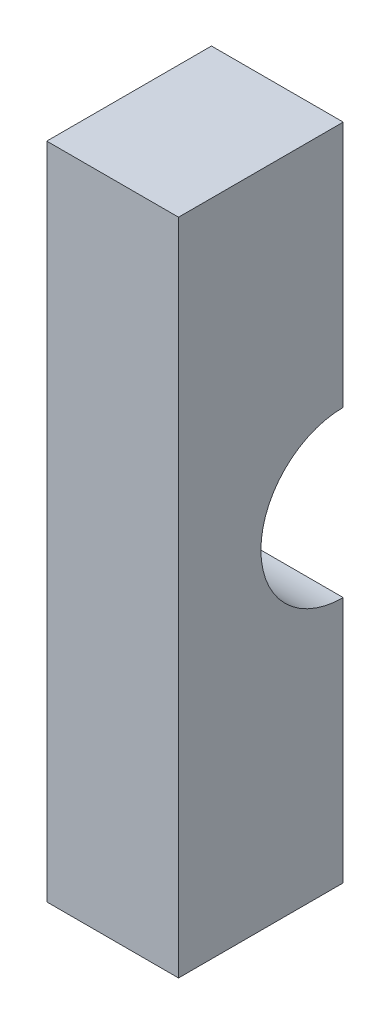
ISO-10303-21;
HEADER;
FILE_DESCRIPTION(('STEP AP214'),'2;1');
FILE_NAME('part.step','',(''),(''),'','','');
FILE_SCHEMA(('AUTOMOTIVE_DESIGN { 1 0 10303 214 1 1 1 1 }'));
ENDSEC;
DATA;
#1=APPLICATION_CONTEXT('core data for automotive mechanical design processes');
#2=APPLICATION_PROTOCOL_DEFINITION('international standard','automotive_design',2000,#1);
#3=PRODUCT_CONTEXT('',#1,'mechanical');
#4=PRODUCT('Part','Part','',(#3));
#5=PRODUCT_RELATED_PRODUCT_CATEGORY('part','',(#4));
#6=PRODUCT_DEFINITION_FORMATION('','',#4);
#7=PRODUCT_DEFINITION_CONTEXT('part definition',#1,'design');
#8=PRODUCT_DEFINITION('design','',#6,#7);
#9=PRODUCT_DEFINITION_SHAPE('','',#8);
#10=(LENGTH_UNIT() NAMED_UNIT(*) SI_UNIT(.MILLI.,.METRE.));
#11=(NAMED_UNIT(*) PLANE_ANGLE_UNIT() SI_UNIT($,.RADIAN.));
#12=(NAMED_UNIT(*) SI_UNIT($,.STERADIAN.) SOLID_ANGLE_UNIT());
#13=UNCERTAINTY_MEASURE_WITH_UNIT(LENGTH_MEASURE(1.E-05),#10,'distance_accuracy_value','');
#14=(GEOMETRIC_REPRESENTATION_CONTEXT(3) GLOBAL_UNCERTAINTY_ASSIGNED_CONTEXT((#13)) GLOBAL_UNIT_ASSIGNED_CONTEXT((#10,
#11,#12)) REPRESENTATION_CONTEXT('',''));
#15=CARTESIAN_POINT('',(0.,0.,0.));
#16=DIRECTION('',(0.,0.,1.));
#17=DIRECTION('',(1.,0.,0.));
#18=AXIS2_PLACEMENT_3D('',#15,#16,#17);
#19=CARTESIAN_POINT('',(15.24,0.,0.));
#20=DIRECTION('',(-1.,0.,0.));
#21=DIRECTION('',(0.,0.,1.));
#22=AXIS2_PLACEMENT_3D('',#19,#20,#21);
#23=PLANE('',#22);
#24=CARTESIAN_POINT('',(15.24,0.,56.86060002));
#25=DIRECTION('',(1.,0.,0.));
#26=DIRECTION('',(0.,0.,-1.));
#27=AXIS2_PLACEMENT_3D('',#24,#25,#26);
#28=CIRCLE('',#27,9.525);
#29=CARTESIAN_POINT('',(15.24,-9.52500000000001,56.86060002));
#30=VERTEX_POINT('',#29);
#31=CARTESIAN_POINT('',(15.24,9.52499999999998,56.86060002));
#32=VERTEX_POINT('',#31);
#33=EDGE_CURVE('E20',#30,#32,#28,.F.);
#34=ORIENTED_EDGE('',*,*,#33,.T.);
#35=DIRECTION('',(0.,-1.,0.));
#36=VECTOR('',#35,1.);
#37=CARTESIAN_POINT('',(15.24,38.1,56.86060002));
#38=LINE('',#37,#36);
#39=CARTESIAN_POINT('',(15.24,38.1,56.86060002));
#40=VERTEX_POINT('',#39);
#41=EDGE_CURVE('E102',#32,#40,#38,.F.);
#42=ORIENTED_EDGE('',*,*,#41,.T.);
#43=DIRECTION('',(0.,0.,-1.));
#44=VECTOR('',#43,1.);
#45=CARTESIAN_POINT('',(15.24,38.1,56.86060002));
#46=LINE('',#45,#44);
#47=CARTESIAN_POINT('',(15.24,38.1,75.91060002));
#48=VERTEX_POINT('',#47);
#49=EDGE_CURVE('E108',#40,#48,#46,.F.);
#50=ORIENTED_EDGE('',*,*,#49,.T.);
#51=DIRECTION('',(0.,1.,0.));
#52=VECTOR('',#51,1.);
#53=CARTESIAN_POINT('',(15.24,38.1,75.91060002));
#54=LINE('',#53,#52);
#55=CARTESIAN_POINT('',(15.24,-38.1,75.91060002));
#56=VERTEX_POINT('',#55);
#57=EDGE_CURVE('E114',#48,#56,#54,.F.);
#58=ORIENTED_EDGE('',*,*,#57,.T.);
#59=DIRECTION('',(0.,0.,1.));
#60=VECTOR('',#59,1.);
#61=CARTESIAN_POINT('',(15.24,-38.1,56.86060002));
#62=LINE('',#61,#60);
#63=CARTESIAN_POINT('',(15.24,-38.1,56.86060002));
#64=VERTEX_POINT('',#63);
#65=EDGE_CURVE('E77',#56,#64,#62,.F.);
#66=ORIENTED_EDGE('',*,*,#65,.T.);
#67=DIRECTION('',(0.,-1.,0.));
#68=VECTOR('',#67,1.);
#69=CARTESIAN_POINT('',(15.24,38.1,56.86060002));
#70=LINE('',#69,#68);
#71=EDGE_CURVE('E72',#64,#30,#70,.F.);
#72=ORIENTED_EDGE('',*,*,#71,.T.);
#73=EDGE_LOOP('',(#34,#42,#50,#58,#66,#72));
#74=FACE_BOUND('',#73,.T.);
#75=ADVANCED_FACE('F17',(#74),#23,.F.);
#76=CARTESIAN_POINT('',(0.,0.,56.86060002));
#77=DIRECTION('',(1.,0.,0.));
#78=DIRECTION('',(0.,0.,-1.));
#79=AXIS2_PLACEMENT_3D('',#76,#77,#78);
#80=CYLINDRICAL_SURFACE('',#79,9.525);
#81=DIRECTION('',(1.,0.,0.));
#82=VECTOR('',#81,1.);
#83=CARTESIAN_POINT('',(15.24,9.52499999999998,56.86060002));
#84=LINE('',#83,#82);
#85=CARTESIAN_POINT('',(0.,9.52499999999998,56.86060002));
#86=VERTEX_POINT('',#85);
#87=EDGE_CURVE('E87',#86,#32,#84,.T.);
#88=ORIENTED_EDGE('',*,*,#87,.T.);
#89=ORIENTED_EDGE('',*,*,#33,.F.);
#90=DIRECTION('',(1.,0.,0.));
#91=VECTOR('',#90,1.);
#92=CARTESIAN_POINT('',(15.24,-9.52500000000001,56.86060002));
#93=LINE('',#92,#91);
#94=CARTESIAN_POINT('',(0.,-9.52500000000001,56.86060002));
#95=VERTEX_POINT('',#94);
#96=EDGE_CURVE('E81',#30,#95,#93,.F.);
#97=ORIENTED_EDGE('',*,*,#96,.T.);
#98=CARTESIAN_POINT('',(0.,0.,56.86060002));
#99=DIRECTION('',(1.,0.,0.));
#100=DIRECTION('',(0.,0.,-1.));
#101=AXIS2_PLACEMENT_3D('',#98,#99,#100);
#102=CIRCLE('',#101,9.525);
#103=EDGE_CURVE('E105',#86,#95,#102,.T.);
#104=ORIENTED_EDGE('',*,*,#103,.F.);
#105=EDGE_LOOP('',(#88,#89,#97,#104));
#106=FACE_BOUND('',#105,.T.);
#107=ADVANCED_FACE('F84',(#106),#80,.F.);
#108=CARTESIAN_POINT('',(15.24,38.1,56.86060002));
#109=DIRECTION('',(0.,0.,1.));
#110=DIRECTION('',(0.,-1.,0.));
#111=AXIS2_PLACEMENT_3D('',#108,#109,#110);
#112=PLANE('',#111);
#113=ORIENTED_EDGE('',*,*,#96,.F.);
#114=ORIENTED_EDGE('',*,*,#71,.F.);
#115=DIRECTION('',(1.,0.,0.));
#116=VECTOR('',#115,1.);
#117=CARTESIAN_POINT('',(15.24,-38.1,56.86060002));
#118=LINE('',#117,#116);
#119=CARTESIAN_POINT('',(0.,-38.1,56.86060002));
#120=VERTEX_POINT('',#119);
#121=EDGE_CURVE('E96',#64,#120,#118,.F.);
#122=ORIENTED_EDGE('',*,*,#121,.T.);
#123=DIRECTION('',(0.,1.,0.));
#124=VECTOR('',#123,1.);
#125=CARTESIAN_POINT('',(0.,0.,56.86060002));
#126=LINE('',#125,#124);
#127=EDGE_CURVE('E92',#95,#120,#126,.F.);
#128=ORIENTED_EDGE('',*,*,#127,.F.);
#129=EDGE_LOOP('',(#113,#114,#122,#128));
#130=FACE_BOUND('',#129,.T.);
#131=ADVANCED_FACE('F90',(#130),#112,.F.);
#132=CARTESIAN_POINT('',(15.24,-38.1,56.86060002));
#133=DIRECTION('',(0.,1.,0.));
#134=DIRECTION('',(0.,0.,1.));
#135=AXIS2_PLACEMENT_3D('',#132,#133,#134);
#136=PLANE('',#135);
#137=ORIENTED_EDGE('',*,*,#121,.F.);
#138=ORIENTED_EDGE('',*,*,#65,.F.);
#139=DIRECTION('',(1.,0.,0.));
#140=VECTOR('',#139,1.);
#141=CARTESIAN_POINT('',(15.24,-38.1,75.91060002));
#142=LINE('',#141,#140);
#143=CARTESIAN_POINT('',(0.,-38.1,75.91060002));
#144=VERTEX_POINT('',#143);
#145=EDGE_CURVE('E111',#56,#144,#142,.F.);
#146=ORIENTED_EDGE('',*,*,#145,.T.);
#147=DIRECTION('',(0.,0.,1.));
#148=VECTOR('',#147,1.);
#149=CARTESIAN_POINT('',(0.,-38.1,0.));
#150=LINE('',#149,#148);
#151=EDGE_CURVE('E127',#120,#144,#150,.T.);
#152=ORIENTED_EDGE('',*,*,#151,.F.);
#153=EDGE_LOOP('',(#137,#138,#146,#152));
#154=FACE_BOUND('',#153,.T.);
#155=ADVANCED_FACE('F162',(#154),#136,.F.);
#156=CARTESIAN_POINT('',(15.24,38.1,75.91060002));
#157=DIRECTION('',(0.,0.,-1.));
#158=DIRECTION('',(0.,1.,0.));
#159=AXIS2_PLACEMENT_3D('',#156,#157,#158);
#160=PLANE('',#159);
#161=ORIENTED_EDGE('',*,*,#145,.F.);
#162=ORIENTED_EDGE('',*,*,#57,.F.);
#163=DIRECTION('',(1.,0.,0.));
#164=VECTOR('',#163,1.);
#165=CARTESIAN_POINT('',(15.24,38.1,75.91060002));
#166=LINE('',#165,#164);
#167=CARTESIAN_POINT('',(0.,38.1,75.91060002));
#168=VERTEX_POINT('',#167);
#169=EDGE_CURVE('E110',#48,#168,#166,.F.);
#170=ORIENTED_EDGE('',*,*,#169,.T.);
#171=DIRECTION('',(0.,1.,0.));
#172=VECTOR('',#171,1.);
#173=CARTESIAN_POINT('',(0.,0.,75.91060002));
#174=LINE('',#173,#172);
#175=EDGE_CURVE('E131',#144,#168,#174,.T.);
#176=ORIENTED_EDGE('',*,*,#175,.F.);
#177=EDGE_LOOP('',(#161,#162,#170,#176));
#178=FACE_BOUND('',#177,.T.);
#179=ADVANCED_FACE('F167',(#178),#160,.F.);
#180=CARTESIAN_POINT('',(15.24,38.1,56.86060002));
#181=DIRECTION('',(0.,-1.,0.));
#182=DIRECTION('',(0.,0.,-1.));
#183=AXIS2_PLACEMENT_3D('',#180,#181,#182);
#184=PLANE('',#183);
#185=ORIENTED_EDGE('',*,*,#169,.F.);
#186=ORIENTED_EDGE('',*,*,#49,.F.);
#187=DIRECTION('',(1.,0.,0.));
#188=VECTOR('',#187,1.);
#189=CARTESIAN_POINT('',(15.24,38.1,56.86060002));
#190=LINE('',#189,#188);
#191=CARTESIAN_POINT('',(0.,38.1,56.86060002));
#192=VERTEX_POINT('',#191);
#193=EDGE_CURVE('E36',#40,#192,#190,.F.);
#194=ORIENTED_EDGE('',*,*,#193,.T.);
#195=DIRECTION('',(0.,0.,1.));
#196=VECTOR('',#195,1.);
#197=CARTESIAN_POINT('',(0.,38.1,0.));
#198=LINE('',#197,#196);
#199=EDGE_CURVE('E27',#168,#192,#198,.F.);
#200=ORIENTED_EDGE('',*,*,#199,.F.);
#201=EDGE_LOOP('',(#185,#186,#194,#200));
#202=FACE_BOUND('',#201,.T.);
#203=ADVANCED_FACE('F170',(#202),#184,.F.);
#204=CARTESIAN_POINT('',(15.24,38.1,56.86060002));
#205=DIRECTION('',(0.,0.,1.));
#206=DIRECTION('',(0.,-1.,0.));
#207=AXIS2_PLACEMENT_3D('',#204,#205,#206);
#208=PLANE('',#207);
#209=ORIENTED_EDGE('',*,*,#87,.F.);
#210=DIRECTION('',(0.,1.,0.));
#211=VECTOR('',#210,1.);
#212=CARTESIAN_POINT('',(0.,0.,56.86060002));
#213=LINE('',#212,#211);
#214=EDGE_CURVE('E11',#192,#86,#213,.F.);
#215=ORIENTED_EDGE('',*,*,#214,.F.);
#216=ORIENTED_EDGE('',*,*,#193,.F.);
#217=ORIENTED_EDGE('',*,*,#41,.F.);
#218=EDGE_LOOP('',(#209,#215,#216,#217));
#219=FACE_BOUND('',#218,.T.);
#220=ADVANCED_FACE('F172',(#219),#208,.F.);
#221=CARTESIAN_POINT('',(0.,0.,0.));
#222=DIRECTION('',(-1.,0.,0.));
#223=DIRECTION('',(0.,0.,1.));
#224=AXIS2_PLACEMENT_3D('',#221,#222,#223);
#225=PLANE('',#224);
#226=ORIENTED_EDGE('',*,*,#199,.T.);
#227=ORIENTED_EDGE('',*,*,#214,.T.);
#228=ORIENTED_EDGE('',*,*,#103,.T.);
#229=ORIENTED_EDGE('',*,*,#127,.T.);
#230=ORIENTED_EDGE('',*,*,#151,.T.);
#231=ORIENTED_EDGE('',*,*,#175,.T.);
#232=EDGE_LOOP('',(#226,#227,#228,#229,#230,#231));
#233=FACE_BOUND('',#232,.T.);
#234=ADVANCED_FACE('F165',(#233),#225,.T.);
#235=CLOSED_SHELL('',(#75,#107,#131,#155,#179,#203,#220,#234));
#236=MANIFOLD_SOLID_BREP('B1',#235);
#237=ADVANCED_BREP_SHAPE_REPRESENTATION('',(#18,#236),#14);
#238=SHAPE_DEFINITION_REPRESENTATION(#9,#237);
ENDSEC;
END-ISO-10303-21;
